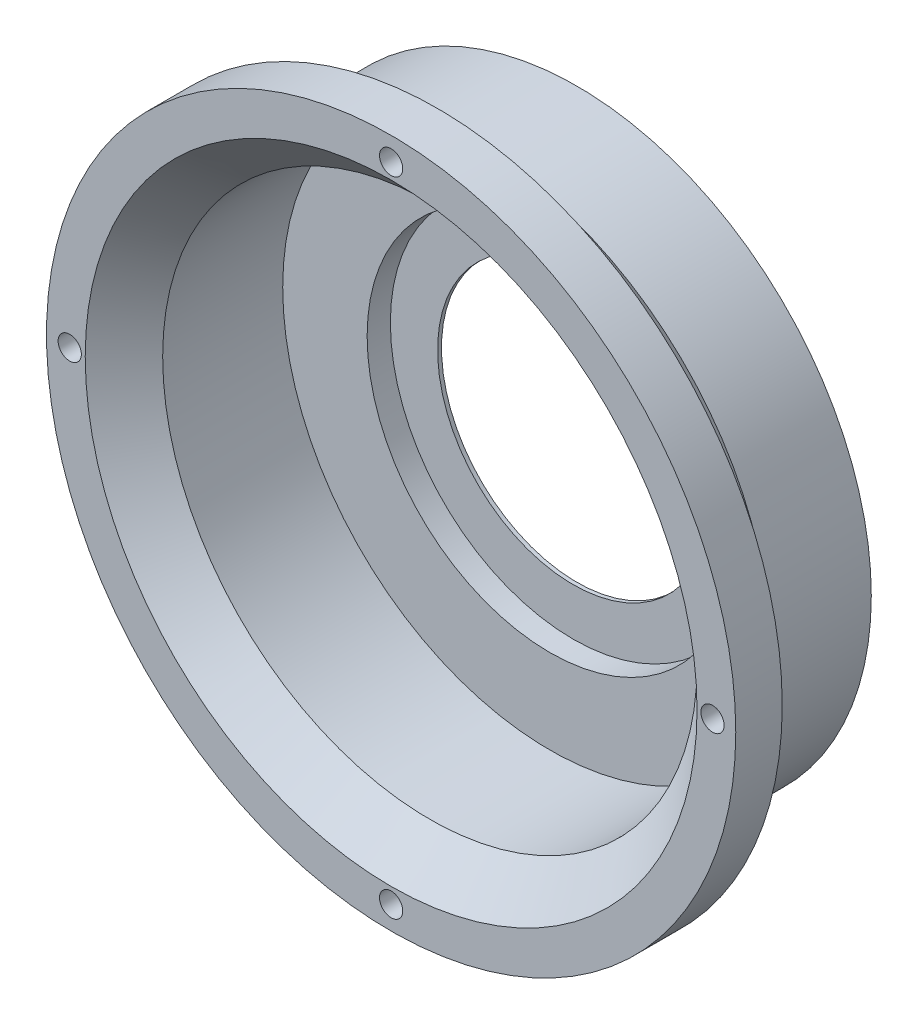
ISO-10303-21;
HEADER;
FILE_DESCRIPTION(('STEP AP214'),'2;1');
FILE_NAME('part.step','',(''),(''),'','','');
FILE_SCHEMA(('AUTOMOTIVE_DESIGN { 1 0 10303 214 1 1 1 1 }'));
ENDSEC;
DATA;
#1=APPLICATION_CONTEXT('core data for automotive mechanical design processes');
#2=APPLICATION_PROTOCOL_DEFINITION('international standard','automotive_design',2000,#1);
#3=PRODUCT_CONTEXT('',#1,'mechanical');
#4=PRODUCT('Part','Part','',(#3));
#5=PRODUCT_RELATED_PRODUCT_CATEGORY('part','',(#4));
#6=PRODUCT_DEFINITION_FORMATION('','',#4);
#7=PRODUCT_DEFINITION_CONTEXT('part definition',#1,'design');
#8=PRODUCT_DEFINITION('design','',#6,#7);
#9=PRODUCT_DEFINITION_SHAPE('','',#8);
#10=(LENGTH_UNIT() NAMED_UNIT(*) SI_UNIT(.MILLI.,.METRE.));
#11=(NAMED_UNIT(*) PLANE_ANGLE_UNIT() SI_UNIT($,.RADIAN.));
#12=(NAMED_UNIT(*) SI_UNIT($,.STERADIAN.) SOLID_ANGLE_UNIT());
#13=UNCERTAINTY_MEASURE_WITH_UNIT(LENGTH_MEASURE(1.E-05),#10,'distance_accuracy_value','');
#14=(GEOMETRIC_REPRESENTATION_CONTEXT(3) GLOBAL_UNCERTAINTY_ASSIGNED_CONTEXT((#13)) GLOBAL_UNIT_ASSIGNED_CONTEXT((#10,
#11,#12)) REPRESENTATION_CONTEXT('',''));
#15=CARTESIAN_POINT('',(0.,0.,0.));
#16=DIRECTION('',(0.,0.,1.));
#17=DIRECTION('',(1.,0.,0.));
#18=AXIS2_PLACEMENT_3D('',#15,#16,#17);
#19=CARTESIAN_POINT('',(0.,0.,24.));
#20=DIRECTION('',(0.,0.,-1.));
#21=DIRECTION('',(-1.,0.,0.));
#22=AXIS2_PLACEMENT_3D('',#19,#20,#21);
#23=CYLINDRICAL_SURFACE('',#22,38.);
#24=CARTESIAN_POINT('',(0.,0.,13.));
#25=DIRECTION('',(0.,0.,1.));
#26=DIRECTION('',(1.,0.,0.));
#27=AXIS2_PLACEMENT_3D('',#24,#25,#26);
#28=CIRCLE('',#27,38.);
#29=CARTESIAN_POINT('',(38.,0.,13.));
#30=VERTEX_POINT('',#29);
#31=EDGE_CURVE('E11',#30,#30,#28,.F.);
#32=ORIENTED_EDGE('',*,*,#31,.T.);
#33=EDGE_LOOP('',(#32));
#34=FACE_BOUND('',#33,.T.);
#35=CARTESIAN_POINT('',(0.,0.,0.));
#36=DIRECTION('',(0.,0.,1.));
#37=DIRECTION('',(1.,0.,0.));
#38=AXIS2_PLACEMENT_3D('',#35,#36,#37);
#39=CIRCLE('',#38,38.);
#40=CARTESIAN_POINT('',(38.,0.,0.));
#41=VERTEX_POINT('',#40);
#42=EDGE_CURVE('E141',#41,#41,#39,.T.);
#43=ORIENTED_EDGE('',*,*,#42,.T.);
#44=EDGE_LOOP('',(#43));
#45=FACE_BOUND('',#44,.T.);
#46=ADVANCED_FACE('F41',(#34,#45),#23,.T.);
#47=CARTESIAN_POINT('',(0.,0.,24.));
#48=DIRECTION('',(0.,0.,1.));
#49=DIRECTION('',(1.,0.,0.));
#50=AXIS2_PLACEMENT_3D('',#47,#48,#49);
#51=PLANE('',#50);
#52=CARTESIAN_POINT('',(0.,0.,24.));
#53=DIRECTION('',(0.,0.,1.));
#54=DIRECTION('',(1.,0.,0.));
#55=AXIS2_PLACEMENT_3D('',#52,#53,#54);
#56=CIRCLE('',#55,39.5);
#57=CARTESIAN_POINT('',(39.5,0.,24.));
#58=VERTEX_POINT('',#57);
#59=EDGE_CURVE('E82',#58,#58,#56,.F.);
#60=ORIENTED_EDGE('',*,*,#59,.T.);
#61=EDGE_LOOP('',(#60));
#62=FACE_BOUND('',#61,.T.);
#63=CARTESIAN_POINT('',(0.,-41.5,24.));
#64=DIRECTION('',(0.,0.,1.));
#65=DIRECTION('',(1.,0.,0.));
#66=AXIS2_PLACEMENT_3D('',#63,#64,#65);
#67=CIRCLE('',#66,1.5);
#68=CARTESIAN_POINT('',(1.5,-41.5,24.));
#69=VERTEX_POINT('',#68);
#70=EDGE_CURVE('E95',#69,#69,#67,.T.);
#71=ORIENTED_EDGE('',*,*,#70,.F.);
#72=EDGE_LOOP('',(#71));
#73=FACE_BOUND('',#72,.T.);
#74=CARTESIAN_POINT('',(-41.5,1.4489647556199E-13,24.));
#75=DIRECTION('',(0.,0.,1.));
#76=DIRECTION('',(1.,0.,0.));
#77=AXIS2_PLACEMENT_3D('',#74,#75,#76);
#78=CIRCLE('',#77,1.5);
#79=CARTESIAN_POINT('',(-40.,1.4489647556199E-13,24.));
#80=VERTEX_POINT('',#79);
#81=EDGE_CURVE('E100',#80,#80,#78,.T.);
#82=ORIENTED_EDGE('',*,*,#81,.F.);
#83=EDGE_LOOP('',(#82));
#84=FACE_BOUND('',#83,.T.);
#85=CARTESIAN_POINT('',(2.8979295112398E-13,41.5,24.));
#86=DIRECTION('',(0.,0.,1.));
#87=DIRECTION('',(1.,0.,0.));
#88=AXIS2_PLACEMENT_3D('',#85,#86,#87);
#89=CIRCLE('',#88,1.5);
#90=CARTESIAN_POINT('',(1.50000000000029,41.5,24.));
#91=VERTEX_POINT('',#90);
#92=EDGE_CURVE('E131',#91,#91,#89,.T.);
#93=ORIENTED_EDGE('',*,*,#92,.F.);
#94=EDGE_LOOP('',(#93));
#95=FACE_BOUND('',#94,.T.);
#96=CARTESIAN_POINT('',(41.5,-4.3468942668597E-13,24.));
#97=DIRECTION('',(0.,0.,1.));
#98=DIRECTION('',(1.,0.,0.));
#99=AXIS2_PLACEMENT_3D('',#96,#97,#98);
#100=CIRCLE('',#99,1.5);
#101=CARTESIAN_POINT('',(43.,-4.3468942668597E-13,24.));
#102=VERTEX_POINT('',#101);
#103=EDGE_CURVE('E132',#102,#102,#100,.T.);
#104=ORIENTED_EDGE('',*,*,#103,.F.);
#105=EDGE_LOOP('',(#104));
#106=FACE_BOUND('',#105,.T.);
#107=CARTESIAN_POINT('',(0.,0.,24.));
#108=DIRECTION('',(0.,0.,1.));
#109=DIRECTION('',(1.,0.,0.));
#110=AXIS2_PLACEMENT_3D('',#107,#108,#109);
#111=CIRCLE('',#110,44.5);
#112=CARTESIAN_POINT('',(44.5,0.,24.));
#113=VERTEX_POINT('',#112);
#114=EDGE_CURVE('E94',#113,#113,#111,.T.);
#115=ORIENTED_EDGE('',*,*,#114,.T.);
#116=EDGE_LOOP('',(#115));
#117=FACE_BOUND('',#116,.T.);
#118=ADVANCED_FACE('F169',(#62,#73,#84,#95,#106,#117),#51,.T.);
#119=CARTESIAN_POINT('',(0.,0.,0.));
#120=DIRECTION('',(0.,0.,1.));
#121=DIRECTION('',(1.,0.,0.));
#122=AXIS2_PLACEMENT_3D('',#119,#120,#121);
#123=PLANE('',#122);
#124=CARTESIAN_POINT('',(0.,0.,0.));
#125=DIRECTION('',(0.,0.,1.));
#126=DIRECTION('',(1.,0.,0.));
#127=AXIS2_PLACEMENT_3D('',#124,#125,#126);
#128=CIRCLE('',#127,17.5);
#129=CARTESIAN_POINT('',(17.5,0.,0.));
#130=VERTEX_POINT('',#129);
#131=EDGE_CURVE('E151',#130,#130,#128,.F.);
#132=ORIENTED_EDGE('',*,*,#131,.F.);
#133=EDGE_LOOP('',(#132));
#134=FACE_BOUND('',#133,.T.);
#135=ORIENTED_EDGE('',*,*,#42,.F.);
#136=EDGE_LOOP('',(#135));
#137=FACE_BOUND('',#136,.T.);
#138=ADVANCED_FACE('F172',(#134,#137),#123,.F.);
#139=CARTESIAN_POINT('',(0.,0.,24.));
#140=DIRECTION('',(0.,0.,-1.));
#141=DIRECTION('',(-1.,0.,0.));
#142=AXIS2_PLACEMENT_3D('',#139,#140,#141);
#143=CYLINDRICAL_SURFACE('',#142,34.5);
#144=CARTESIAN_POINT('',(0.,0.,19.));
#145=DIRECTION('',(0.,0.,1.));
#146=DIRECTION('',(1.,0.,0.));
#147=AXIS2_PLACEMENT_3D('',#144,#145,#146);
#148=CIRCLE('',#147,34.5);
#149=CARTESIAN_POINT('',(34.5,0.,19.));
#150=VERTEX_POINT('',#149);
#151=EDGE_CURVE('E138',#150,#150,#148,.T.);
#152=ORIENTED_EDGE('',*,*,#151,.T.);
#153=EDGE_LOOP('',(#152));
#154=FACE_BOUND('',#153,.T.);
#155=CARTESIAN_POINT('',(0.,0.,3.5));
#156=DIRECTION('',(0.,0.,1.));
#157=DIRECTION('',(1.,0.,0.));
#158=AXIS2_PLACEMENT_3D('',#155,#156,#157);
#159=CIRCLE('',#158,34.5);
#160=CARTESIAN_POINT('',(34.5,0.,3.5));
#161=VERTEX_POINT('',#160);
#162=EDGE_CURVE('E144',#161,#161,#159,.T.);
#163=ORIENTED_EDGE('',*,*,#162,.F.);
#164=EDGE_LOOP('',(#163));
#165=FACE_BOUND('',#164,.T.);
#166=ADVANCED_FACE('F214',(#154,#165),#143,.F.);
#167=CARTESIAN_POINT('',(0.,0.,3.5));
#168=DIRECTION('',(0.,0.,1.));
#169=DIRECTION('',(1.,0.,0.));
#170=AXIS2_PLACEMENT_3D('',#167,#168,#169);
#171=PLANE('',#170);
#172=CARTESIAN_POINT('',(0.,0.,3.5));
#173=DIRECTION('',(0.,0.,1.));
#174=DIRECTION('',(1.,0.,0.));
#175=AXIS2_PLACEMENT_3D('',#172,#173,#174);
#176=CIRCLE('',#175,23.6);
#177=CARTESIAN_POINT('',(23.6,0.,3.5));
#178=VERTEX_POINT('',#177);
#179=EDGE_CURVE('E148',#178,#178,#176,.T.);
#180=ORIENTED_EDGE('',*,*,#179,.F.);
#181=EDGE_LOOP('',(#180));
#182=FACE_BOUND('',#181,.T.);
#183=ORIENTED_EDGE('',*,*,#162,.T.);
#184=EDGE_LOOP('',(#183));
#185=FACE_BOUND('',#184,.T.);
#186=ADVANCED_FACE('F216',(#182,#185),#171,.T.);
#187=CARTESIAN_POINT('',(0.,0.,0.5));
#188=DIRECTION('',(0.,0.,1.));
#189=DIRECTION('',(1.,0.,0.));
#190=AXIS2_PLACEMENT_3D('',#187,#188,#189);
#191=CYLINDRICAL_SURFACE('',#190,23.6);
#192=CARTESIAN_POINT('',(0.,0.,0.5));
#193=DIRECTION('',(0.,0.,1.));
#194=DIRECTION('',(1.,0.,0.));
#195=AXIS2_PLACEMENT_3D('',#192,#193,#194);
#196=CIRCLE('',#195,23.6);
#197=CARTESIAN_POINT('',(23.6,0.,0.5));
#198=VERTEX_POINT('',#197);
#199=EDGE_CURVE('E147',#198,#198,#196,.T.);
#200=ORIENTED_EDGE('',*,*,#199,.F.);
#201=EDGE_LOOP('',(#200));
#202=FACE_BOUND('',#201,.T.);
#203=ORIENTED_EDGE('',*,*,#179,.T.);
#204=EDGE_LOOP('',(#203));
#205=FACE_BOUND('',#204,.T.);
#206=ADVANCED_FACE('F221',(#202,#205),#191,.F.);
#207=CARTESIAN_POINT('',(0.,0.,0.5));
#208=DIRECTION('',(0.,0.,1.));
#209=DIRECTION('',(1.,0.,0.));
#210=AXIS2_PLACEMENT_3D('',#207,#208,#209);
#211=PLANE('',#210);
#212=CARTESIAN_POINT('',(0.,0.,0.5));
#213=DIRECTION('',(0.,0.,1.));
#214=DIRECTION('',(1.,0.,0.));
#215=AXIS2_PLACEMENT_3D('',#212,#213,#214);
#216=CIRCLE('',#215,17.5);
#217=CARTESIAN_POINT('',(17.5,0.,0.5));
#218=VERTEX_POINT('',#217);
#219=EDGE_CURVE('E156',#218,#218,#216,.T.);
#220=ORIENTED_EDGE('',*,*,#219,.F.);
#221=EDGE_LOOP('',(#220));
#222=FACE_BOUND('',#221,.T.);
#223=ORIENTED_EDGE('',*,*,#199,.T.);
#224=EDGE_LOOP('',(#223));
#225=FACE_BOUND('',#224,.T.);
#226=ADVANCED_FACE('F190',(#222,#225),#211,.T.);
#227=CARTESIAN_POINT('',(0.,0.,-49.4974746830583));
#228=DIRECTION('',(0.,0.,1.));
#229=DIRECTION('',(1.,0.,0.));
#230=AXIS2_PLACEMENT_3D('',#227,#228,#229);
#231=CYLINDRICAL_SURFACE('',#230,17.5);
#232=ORIENTED_EDGE('',*,*,#131,.T.);
#233=EDGE_LOOP('',(#232));
#234=FACE_BOUND('',#233,.T.);
#235=ORIENTED_EDGE('',*,*,#219,.T.);
#236=EDGE_LOOP('',(#235));
#237=FACE_BOUND('',#236,.T.);
#238=ADVANCED_FACE('F183',(#234,#237),#231,.F.);
#239=CARTESIAN_POINT('',(0.,0.,18.));
#240=DIRECTION('',(0.,0.,1.));
#241=DIRECTION('',(1.,0.,0.));
#242=AXIS2_PLACEMENT_3D('',#239,#240,#241);
#243=CYLINDRICAL_SURFACE('',#242,44.5);
#244=CARTESIAN_POINT('',(0.,0.,18.));
#245=DIRECTION('',(0.,0.,1.));
#246=DIRECTION('',(1.,0.,0.));
#247=AXIS2_PLACEMENT_3D('',#244,#245,#246);
#248=CIRCLE('',#247,44.5);
#249=CARTESIAN_POINT('',(44.5,0.,18.));
#250=VERTEX_POINT('',#249);
#251=EDGE_CURVE('E97',#250,#250,#248,.T.);
#252=ORIENTED_EDGE('',*,*,#251,.T.);
#253=EDGE_LOOP('',(#252));
#254=FACE_BOUND('',#253,.T.);
#255=ORIENTED_EDGE('',*,*,#114,.F.);
#256=EDGE_LOOP('',(#255));
#257=FACE_BOUND('',#256,.T.);
#258=ADVANCED_FACE('F181',(#254,#257),#243,.T.);
#259=CARTESIAN_POINT('',(0.,0.,18.));
#260=DIRECTION('',(0.,0.,1.));
#261=DIRECTION('',(1.,0.,0.));
#262=AXIS2_PLACEMENT_3D('',#259,#260,#261);
#263=PLANE('',#262);
#264=CARTESIAN_POINT('',(0.,0.,18.));
#265=DIRECTION('',(0.,0.,1.));
#266=DIRECTION('',(1.,0.,0.));
#267=AXIS2_PLACEMENT_3D('',#264,#265,#266);
#268=CIRCLE('',#267,43.);
#269=CARTESIAN_POINT('',(0.,-43.,18.));
#270=VERTEX_POINT('',#269);
#271=CARTESIAN_POINT('',(43.,-4.50401088637133E-13,18.));
#272=VERTEX_POINT('',#271);
#273=EDGE_CURVE('E74',#270,#272,#268,.T.);
#274=ORIENTED_EDGE('',*,*,#273,.T.);
#275=CARTESIAN_POINT('',(0.,0.,18.));
#276=DIRECTION('',(0.,0.,1.));
#277=DIRECTION('',(1.,0.,0.));
#278=AXIS2_PLACEMENT_3D('',#275,#276,#277);
#279=CIRCLE('',#278,43.);
#280=CARTESIAN_POINT('',(3.00267391066803E-13,43.,18.));
#281=VERTEX_POINT('',#280);
#282=EDGE_CURVE('E57',#272,#281,#279,.T.);
#283=ORIENTED_EDGE('',*,*,#282,.T.);
#284=CARTESIAN_POINT('',(0.,0.,18.));
#285=DIRECTION('',(0.,0.,1.));
#286=DIRECTION('',(1.,0.,0.));
#287=AXIS2_PLACEMENT_3D('',#284,#285,#286);
#288=CIRCLE('',#287,43.);
#289=CARTESIAN_POINT('',(-43.,1.50133693496514E-13,18.));
#290=VERTEX_POINT('',#289);
#291=EDGE_CURVE('E87',#281,#290,#288,.T.);
#292=ORIENTED_EDGE('',*,*,#291,.T.);
#293=CARTESIAN_POINT('',(0.,0.,18.));
#294=DIRECTION('',(0.,0.,1.));
#295=DIRECTION('',(1.,0.,0.));
#296=AXIS2_PLACEMENT_3D('',#293,#294,#295);
#297=CIRCLE('',#296,43.);
#298=EDGE_CURVE('E81',#290,#270,#297,.T.);
#299=ORIENTED_EDGE('',*,*,#298,.T.);
#300=EDGE_LOOP('',(#274,#283,#292,#299));
#301=FACE_BOUND('',#300,.T.);
#302=ORIENTED_EDGE('',*,*,#251,.F.);
#303=EDGE_LOOP('',(#302));
#304=FACE_BOUND('',#303,.T.);
#305=ADVANCED_FACE('F85',(#301,#304),#263,.F.);
#306=CARTESIAN_POINT('',(41.5,-4.3468942668597E-13,13.7573593128807));
#307=DIRECTION('',(0.,0.,1.));
#308=DIRECTION('',(1.,0.,0.));
#309=AXIS2_PLACEMENT_3D('',#306,#307,#308);
#310=CYLINDRICAL_SURFACE('',#309,1.5);
#311=CARTESIAN_POINT('',(40.,-4.19404963032972E-13,15.));
#312=CARTESIAN_POINT('',(40.0000054472923,0.0661882973322198,15.000005743782));
#313=CARTESIAN_POINT('',(40.0044261040572,0.132486348752539,15.0045928921817));
#314=CARTESIAN_POINT('',(40.0217322131698,0.262818295696041,15.0225417598906));
#315=CARTESIAN_POINT('',(40.0346391255251,0.326846016247925,15.0359257245213));
#316=CARTESIAN_POINT('',(40.0677527325686,0.45024295856951,15.0702353901676));
#317=CARTESIAN_POINT('',(40.0879024431701,0.509644259724409,15.0911022154164));
#318=CARTESIAN_POINT('',(40.1342423615317,0.623281385013478,15.1390419797506));
#319=CARTESIAN_POINT('',(40.1604331510053,0.677516710989422,15.1661155164971));
#320=CARTESIAN_POINT('',(40.2300101729092,0.802638076158851,15.2379499559189));
#321=CARTESIAN_POINT('',(40.275941090042,0.870618363966243,15.28530351592));
#322=CARTESIAN_POINT('',(40.3748693088483,0.995208082789842,15.3870865955773));
#323=CARTESIAN_POINT('',(40.427883290934,1.05178985669921,15.4415328104258));
#324=CARTESIAN_POINT('',(40.5611571305409,1.17463330077802,15.5781018968541));
#325=CARTESIAN_POINT('',(40.6438170098305,1.2356761631156,15.6625671880098));
#326=CARTESIAN_POINT('',(40.8150584339953,1.33821876872422,15.8369624041623));
#327=CARTESIAN_POINT('',(40.9036449064991,1.37970201276868,15.9268968706721));
#328=CARTESIAN_POINT('',(41.0869694982902,1.44539057866594,16.1123742011504));
#329=CARTESIAN_POINT('',(41.1818118197911,1.46905384802057,16.2080041866863));
#330=CARTESIAN_POINT('',(41.3732531986949,1.4977681664745,16.4003537018665));
#331=CARTESIAN_POINT('',(41.4698534498262,1.50280605498494,16.497073953502));
#332=CARTESIAN_POINT('',(41.6837044004202,1.49333374649012,16.7104438487362));
#333=CARTESIAN_POINT('',(41.800951156682,1.47441034750825,16.826929776122));
#334=CARTESIAN_POINT('',(42.0317626850694,1.40770479651774,17.0553120732162));
#335=CARTESIAN_POINT('',(42.1453319431435,1.35995931655902,17.1672140824328));
#336=CARTESIAN_POINT('',(42.3247526676781,1.2555464944452,17.3433499832528));
#337=CARTESIAN_POINT('',(42.3932235806938,1.20807368378323,17.4103960709151));
#338=CARTESIAN_POINT('',(42.5243490950635,1.09907067403301,17.5385124815464));
#339=CARTESIAN_POINT('',(42.5870133507756,1.03756441933061,17.5995927330171));
#340=CARTESIAN_POINT('',(42.6899326923088,0.915883787996921,17.6997226744458));
#341=CARTESIAN_POINT('',(42.7320043539671,0.858749354726768,17.7405868654106));
#342=CARTESIAN_POINT('',(42.809126674934,0.735820536182839,17.8154050393435));
#343=CARTESIAN_POINT('',(42.844186083608,0.670037114574688,17.8493676344655));
#344=CARTESIAN_POINT('',(42.8994441349478,0.543507673920048,17.9028489175321));
#345=CARTESIAN_POINT('',(42.9211922231482,0.484082319954972,17.9238774699195));
#346=CARTESIAN_POINT('',(42.9573157365138,0.361016454348,17.9587885419139));
#347=CARTESIAN_POINT('',(42.9716959629677,0.297378718330247,17.9726757152431));
#348=CARTESIAN_POINT('',(42.9921163882609,0.167181747749942,17.9923919014507));
#349=CARTESIAN_POINT('',(42.9981127672809,0.100609025438486,17.9981785756755));
#350=CARTESIAN_POINT('',(43.0011236727402,-0.0329275793021889,18.0010844969985));
#351=CARTESIAN_POINT('',(42.9981398824998,-0.0998913860746713,17.9982053684896));
#352=CARTESIAN_POINT('',(42.9840797439481,-0.226293201366086,17.984632797652));
#353=CARTESIAN_POINT('',(42.9737112993543,-0.285887769800416,17.9746229044776));
#354=CARTESIAN_POINT('',(42.9463512494883,-0.402032801008781,17.9481935246122));
#355=CARTESIAN_POINT('',(42.9293585876895,-0.458582776548525,17.9317730154622));
#356=CARTESIAN_POINT('',(42.8884072129076,-0.57108208153932,17.8921695879123));
#357=CARTESIAN_POINT('',(42.8640746779084,-0.626765252109117,17.8686234715992));
#358=CARTESIAN_POINT('',(42.8101319289882,-0.732874049928063,17.8163711117418));
#359=CARTESIAN_POINT('',(42.7805186369436,-0.783296583463531,17.7876618585506));
#360=CARTESIAN_POINT('',(42.699846530062,-0.904528284009289,17.7093608020299));
#361=CARTESIAN_POINT('',(42.6458709543426,-0.971550922944913,17.6568915057028));
#362=CARTESIAN_POINT('',(42.5310238550869,-1.09269933390905,17.5450130415171));
#363=CARTESIAN_POINT('',(42.4701351755109,-1.14679193835882,17.4855865964237));
#364=CARTESIAN_POINT('',(42.3206036957628,-1.26030154585405,17.3393103686237));
#365=CARTESIAN_POINT('',(42.2299643635443,-1.31441091934273,17.2503890224019));
#366=CARTESIAN_POINT('',(42.0440946896208,-1.40161071999443,17.0674252444808));
#367=CARTESIAN_POINT('',(41.9488617232188,-1.43468897367029,16.9733798809636));
#368=CARTESIAN_POINT('',(41.754050500248,-1.48180205072087,16.7803271082568));
#369=CARTESIAN_POINT('',(41.65442284345,-1.49535796703668,16.6812547208232));
#370=CARTESIAN_POINT('',(41.4550398134853,-1.50264435724385,16.4822637291344));
#371=CARTESIAN_POINT('',(41.3552844201638,-1.49635305378194,16.382344315407));
#372=CARTESIAN_POINT('',(41.1980818438425,-1.47049474056435,16.2243164823801));
#373=CARTESIAN_POINT('',(41.1399566719465,-1.4573811586411,16.1657598874421));
#374=CARTESIAN_POINT('',(41.024818494981,-1.42400730509327,16.0495226195485));
#375=CARTESIAN_POINT('',(40.9678058671454,-1.403744652365,15.9918422451157));
#376=CARTESIAN_POINT('',(40.855537568326,-1.35587114291762,15.8780240690296));
#377=CARTESIAN_POINT('',(40.8002791179353,-1.32827263452789,15.8218838484465));
#378=CARTESIAN_POINT('',(40.6921017761149,-1.26538976339165,15.7117609150044));
#379=CARTESIAN_POINT('',(40.6391811345518,-1.23011127149174,15.6577765912044));
#380=CARTESIAN_POINT('',(40.528045275473,-1.14497910210727,15.544191706991));
#381=CARTESIAN_POINT('',(40.47037870989,-1.09368554960414,15.4851156408008));
#382=CARTESIAN_POINT('',(40.3611361345072,-0.979397221938192,15.3729789706544));
#383=CARTESIAN_POINT('',(40.3095500136442,-0.916422333549175,15.3199083863349));
#384=CARTESIAN_POINT('',(40.2254419945224,-0.793570757236304,15.2332342199484));
#385=CARTESIAN_POINT('',(40.1912249896784,-0.736075608699613,15.1979189223471));
#386=CARTESIAN_POINT('',(40.1296678751256,-0.613881793946159,15.1343175431936));
#387=CARTESIAN_POINT('',(40.1023216895931,-0.549189565634589,15.1060252515083));
#388=CARTESIAN_POINT('',(40.0604970360535,-0.425779221323343,15.0627213087988));
#389=CARTESIAN_POINT('',(40.0445917695185,-0.368062737396531,15.0462392680033));
#390=CARTESIAN_POINT('',(40.0196980976932,-0.249680028063641,15.0204336860041));
#391=CARTESIAN_POINT('',(40.0106918154219,-0.189021862463329,15.0110916434356));
#392=CARTESIAN_POINT('',(40.0036387594053,-0.106579571044911,15.003775060487));
#393=CARTESIAN_POINT('',(40.0022765949019,-0.0853161328877249,15.002361911423));
#394=CARTESIAN_POINT('',(40.0004562445343,-0.0427056168208035,15.0004733592491));
#395=CARTESIAN_POINT('',(39.9999982421951,-0.0213585228116477,14.9999981465198));
#396=CARTESIAN_POINT('',(40.,-4.19404963032972E-13,15.));
#397=B_SPLINE_CURVE_WITH_KNOTS('',3,(#311,#312,#313,#314,#315,#316,#317,#318,#319,#320,#321,
#322,#323,#324,#325,#326,#327,#328,#329,#330,#331,#332,#333,#334,#335,#336,#337,#338,#339,#340,
#341,#342,#343,#344,#345,#346,#347,#348,#349,#350,#351,#352,#353,#354,#355,#356,#357,#358,#359,
#360,#361,#362,#363,#364,#365,#366,#367,#368,#369,#370,#371,#372,#373,#374,#375,#376,#377,#378,
#379,#380,#381,#382,#383,#384,#385,#386,#387,#388,#389,#390,#391,#392,#393,#394,#395,#396),
.UNSPECIFIED.,.T.,.F.,(4,2,2,2,2,2,2,2,2,2,2,2,2,2,2,2,2,2,2,2,2,2,2,2,2,2,2,2,2,2,2,2,2,2,2,2,
2,2,2,2,2,2,4),(0.,0.198464940872941,0.397433699351377,0.594870119465364,0.792325559263223,
1.07493281835343,1.35821774254563,1.75511611139778,2.15234868166953,2.56122412517795,
2.97038842260693,3.46709873280756,3.96317837707443,4.28303223456898,4.60234437345552,
4.84712653965447,5.09160135303725,5.29083380221154,5.48993625532039,5.69007551479113,
5.89017726076803,6.0733057654406,6.25646349007053,6.45125159408388,6.64615361234699,
6.94682750071999,7.24826458137449,7.66011845338932,8.07221050312903,8.49424891048967,
8.91675056031071,9.16710879406121,9.41755049216071,9.66757326646308,9.91740558162512,
10.2080777262443,10.4982594866056,10.7244228042368,10.9503854175004,11.1359244717603,
11.3209811065245,11.3850114259759,11.4490547408471),.UNSPECIFIED.);
#398=EDGE_CURVE('E47',#272,#272,#397,.T.);
#399=ORIENTED_EDGE('',*,*,#398,.T.);
#400=EDGE_LOOP('',(#399));
#401=FACE_BOUND('',#400,.T.);
#402=ORIENTED_EDGE('',*,*,#103,.T.);
#403=EDGE_LOOP('',(#402));
#404=FACE_BOUND('',#403,.T.);
#405=ADVANCED_FACE('F124',(#401,#404),#310,.F.);
#406=CARTESIAN_POINT('',(2.8979295112398E-13,41.5,13.7573593128807));
#407=DIRECTION('',(0.,0.,1.));
#408=DIRECTION('',(1.,0.,0.));
#409=AXIS2_PLACEMENT_3D('',#406,#407,#408);
#410=CYLINDRICAL_SURFACE('',#409,1.5);
#411=CARTESIAN_POINT('',(2.79745709479246E-13,40.,15.));
#412=CARTESIAN_POINT('',(-0.0661882973323588,40.0000054472923,15.000005743782));
#413=CARTESIAN_POINT('',(-0.132486348752677,40.0044261040572,15.0045928921817));
#414=CARTESIAN_POINT('',(-0.262818295696179,40.0217322131698,15.0225417598906));
#415=CARTESIAN_POINT('',(-0.326846016248065,40.0346391255251,15.0359257245213));
#416=CARTESIAN_POINT('',(-0.45024295856965,40.0677527325686,15.0702353901676));
#417=CARTESIAN_POINT('',(-0.509644259724547,40.0879024431701,15.0911022154164));
#418=CARTESIAN_POINT('',(-0.623281385013615,40.1342423615317,15.1390419797506));
#419=CARTESIAN_POINT('',(-0.677516710989561,40.1604331510053,15.1661155164971));
#420=CARTESIAN_POINT('',(-0.802638076158994,40.2300101729092,15.2379499559189));
#421=CARTESIAN_POINT('',(-0.870618363966387,40.275941090042,15.28530351592));
#422=CARTESIAN_POINT('',(-0.995208082789986,40.3748693088483,15.3870865955773));
#423=CARTESIAN_POINT('',(-1.05178985669935,40.427883290934,15.4415328104258));
#424=CARTESIAN_POINT('',(-1.17463330077817,40.5611571305408,15.5781018968541));
#425=CARTESIAN_POINT('',(-1.23567616311575,40.6438170098305,15.6625671880098));
#426=CARTESIAN_POINT('',(-1.33821876872437,40.8150584339952,15.8369624041623));
#427=CARTESIAN_POINT('',(-1.37970201276883,40.9036449064991,15.9268968706721));
#428=CARTESIAN_POINT('',(-1.44539057866609,41.0869694982902,16.1123742011504));
#429=CARTESIAN_POINT('',(-1.46905384802072,41.1818118197911,16.2080041866863));
#430=CARTESIAN_POINT('',(-1.49776816647464,41.3732531986949,16.4003537018665));
#431=CARTESIAN_POINT('',(-1.50280605498509,41.4698534498262,16.497073953502));
#432=CARTESIAN_POINT('',(-1.49333374649027,41.6837044004202,16.7104438487362));
#433=CARTESIAN_POINT('',(-1.47441034750839,41.800951156682,16.826929776122));
#434=CARTESIAN_POINT('',(-1.40770479651788,42.0317626850694,17.0553120732162));
#435=CARTESIAN_POINT('',(-1.35995931655916,42.1453319431435,17.1672140824328));
#436=CARTESIAN_POINT('',(-1.25554649444534,42.3247526676781,17.3433499832528));
#437=CARTESIAN_POINT('',(-1.20807368378338,42.3932235806938,17.4103960709151));
#438=CARTESIAN_POINT('',(-1.09907067403316,42.5243490950635,17.5385124815464));
#439=CARTESIAN_POINT('',(-1.03756441933075,42.5870133507756,17.5995927330171));
#440=CARTESIAN_POINT('',(-0.91588378799706,42.6899326923088,17.6997226744458));
#441=CARTESIAN_POINT('',(-0.858749354726906,42.7320043539671,17.7405868654106));
#442=CARTESIAN_POINT('',(-0.735820536182975,42.809126674934,17.8154050393435));
#443=CARTESIAN_POINT('',(-0.670037114574825,42.844186083608,17.8493676344655));
#444=CARTESIAN_POINT('',(-0.543507673920184,42.8994441349478,17.9028489175321));
#445=CARTESIAN_POINT('',(-0.484082319955106,42.9211922231482,17.9238774699195));
#446=CARTESIAN_POINT('',(-0.361016454348132,42.9573157365138,17.9587885419139));
#447=CARTESIAN_POINT('',(-0.297378718330378,42.9716959629677,17.9726757152431));
#448=CARTESIAN_POINT('',(-0.167181747750072,42.9921163882608,17.9923919014507));
#449=CARTESIAN_POINT('',(-0.100609025438615,42.9981127672809,17.9981785756755));
#450=CARTESIAN_POINT('',(0.032927579302059,43.0011236727402,18.0010844969985));
#451=CARTESIAN_POINT('',(0.0998913860745412,42.9981398824998,17.9982053684896));
#452=CARTESIAN_POINT('',(0.226293201365955,42.9840797439481,17.984632797652));
#453=CARTESIAN_POINT('',(0.285887769800286,42.9737112993543,17.9746229044776));
#454=CARTESIAN_POINT('',(0.402032801008649,42.9463512494883,17.9481935246122));
#455=CARTESIAN_POINT('',(0.45858277654839,42.9293585876895,17.9317730154622));
#456=CARTESIAN_POINT('',(0.571082081539185,42.8884072129076,17.8921695879123));
#457=CARTESIAN_POINT('',(0.626765252108984,42.8640746779084,17.8686234715991));
#458=CARTESIAN_POINT('',(0.732874049927932,42.8101319289881,17.8163711117418));
#459=CARTESIAN_POINT('',(0.7832965834634,42.7805186369435,17.7876618585506));
#460=CARTESIAN_POINT('',(0.90452828400916,42.699846530062,17.7093608020299));
#461=CARTESIAN_POINT('',(0.971550922944784,42.6458709543425,17.6568915057028));
#462=CARTESIAN_POINT('',(1.09269933390892,42.5310238550869,17.5450130415171));
#463=CARTESIAN_POINT('',(1.14679193835869,42.4701351755109,17.4855865964237));
#464=CARTESIAN_POINT('',(1.26030154585392,42.3206036957627,17.3393103686237));
#465=CARTESIAN_POINT('',(1.3144109193426,42.2299643635443,17.2503890224019));
#466=CARTESIAN_POINT('',(1.4016107199943,42.0440946896208,17.0674252444807));
#467=CARTESIAN_POINT('',(1.43468897367015,41.9488617232188,16.9733798809636));
#468=CARTESIAN_POINT('',(1.48180205072073,41.7540505002479,16.7803271082567));
#469=CARTESIAN_POINT('',(1.49535796703654,41.65442284345,16.6812547208232));
#470=CARTESIAN_POINT('',(1.50264435724371,41.4550398134852,16.4822637291343));
#471=CARTESIAN_POINT('',(1.49635305378179,41.3552844201638,16.382344315407));
#472=CARTESIAN_POINT('',(1.4704947405642,41.1980818438424,16.2243164823801));
#473=CARTESIAN_POINT('',(1.45738115864095,41.1399566719465,16.165759887442));
#474=CARTESIAN_POINT('',(1.42400730509312,41.0248184949809,16.0495226195485));
#475=CARTESIAN_POINT('',(1.40374465236485,40.9678058671453,15.9918422451156));
#476=CARTESIAN_POINT('',(1.35587114291746,40.855537568326,15.8780240690295));
#477=CARTESIAN_POINT('',(1.32827263452774,40.8002791179353,15.8218838484465));
#478=CARTESIAN_POINT('',(1.26538976339149,40.6921017761149,15.7117609150044));
#479=CARTESIAN_POINT('',(1.23011127149158,40.6391811345518,15.6577765912043));
#480=CARTESIAN_POINT('',(1.14497910210711,40.528045275473,15.5441917069909));
#481=CARTESIAN_POINT('',(1.09368554960398,40.47037870989,15.4851156408008));
#482=CARTESIAN_POINT('',(0.979397221938034,40.3611361345071,15.3729789706544));
#483=CARTESIAN_POINT('',(0.91642233354902,40.3095500136441,15.3199083863349));
#484=CARTESIAN_POINT('',(0.793570757236146,40.2254419945224,15.2332342199484));
#485=CARTESIAN_POINT('',(0.73607560869945,40.1912249896784,15.1979189223471));
#486=CARTESIAN_POINT('',(0.613881793945994,40.1296678751256,15.1343175431936));
#487=CARTESIAN_POINT('',(0.549189565634426,40.1023216895931,15.1060252515083));
#488=CARTESIAN_POINT('',(0.425779221323182,40.0604970360535,15.0627213087987));
#489=CARTESIAN_POINT('',(0.36806273739637,40.0445917695184,15.0462392680033));
#490=CARTESIAN_POINT('',(0.249680028063477,40.0196980976932,15.0204336860041));
#491=CARTESIAN_POINT('',(0.189021862463165,40.0106918154219,15.0110916434356));
#492=CARTESIAN_POINT('',(0.106579571044751,40.0036387594053,15.003775060487));
#493=CARTESIAN_POINT('',(0.0853161328875697,40.0022765949019,15.002361911423));
#494=CARTESIAN_POINT('',(0.0427056168206567,40.0004562445342,15.0004733592491));
#495=CARTESIAN_POINT('',(0.0213585228115044,39.9999982421951,14.9999981465198));
#496=CARTESIAN_POINT('',(2.79745709479246E-13,40.,15.));
#497=B_SPLINE_CURVE_WITH_KNOTS('',3,(#411,#412,#413,#414,#415,#416,#417,#418,#419,#420,#421,
#422,#423,#424,#425,#426,#427,#428,#429,#430,#431,#432,#433,#434,#435,#436,#437,#438,#439,#440,
#441,#442,#443,#444,#445,#446,#447,#448,#449,#450,#451,#452,#453,#454,#455,#456,#457,#458,#459,
#460,#461,#462,#463,#464,#465,#466,#467,#468,#469,#470,#471,#472,#473,#474,#475,#476,#477,#478,
#479,#480,#481,#482,#483,#484,#485,#486,#487,#488,#489,#490,#491,#492,#493,#494,#495,#496),
.UNSPECIFIED.,.T.,.F.,(4,2,2,2,2,2,2,2,2,2,2,2,2,2,2,2,2,2,2,2,2,2,2,2,2,2,2,2,2,2,2,2,2,2,2,2,
2,2,2,2,2,2,4),(0.,0.198464940872939,0.397433699351374,0.594870119465364,0.792325559263223,
1.07493281835344,1.35821774254564,1.75511611139779,2.15234868166954,2.56122412517796,
2.97038842260694,3.46709873280757,3.96317837707443,4.28303223456898,4.60234437345553,
4.84712653965448,5.09160135303726,5.29083380221156,5.48993625532041,5.69007551479116,
5.89017726076805,6.07330576544062,6.25646349007056,6.45125159408391,6.64615361234701,
6.94682750072003,7.24826458137453,7.66011845338937,8.07221050312908,8.49424891048972,
8.91675056031076,9.16710879406126,9.41755049216076,9.66757326646312,9.91740558162516,
10.2080777262443,10.4982594866056,10.7244228042368,10.9503854175004,11.1359244717603,
11.3209811065245,11.3850114259759,11.4490547408471),.UNSPECIFIED.);
#498=EDGE_CURVE('E65',#281,#281,#497,.T.);
#499=ORIENTED_EDGE('',*,*,#498,.T.);
#500=EDGE_LOOP('',(#499));
#501=FACE_BOUND('',#500,.T.);
#502=ORIENTED_EDGE('',*,*,#92,.T.);
#503=EDGE_LOOP('',(#502));
#504=FACE_BOUND('',#503,.T.);
#505=ADVANCED_FACE('F120',(#501,#504),#410,.F.);
#506=CARTESIAN_POINT('',(-41.5,1.4489647556199E-13,13.7573593128807));
#507=DIRECTION('',(0.,0.,1.));
#508=DIRECTION('',(1.,0.,0.));
#509=AXIS2_PLACEMENT_3D('',#506,#507,#508);
#510=CYLINDRICAL_SURFACE('',#509,1.5);
#511=CARTESIAN_POINT('',(-40.,1.39744694028084E-13,15.));
#512=CARTESIAN_POINT('',(-40.0000054472923,-0.0661882973324991,15.000005743782));
#513=CARTESIAN_POINT('',(-40.0044261040572,-0.132486348752817,15.0045928921817));
#514=CARTESIAN_POINT('',(-40.0217322131698,-0.262818295696319,15.0225417598906));
#515=CARTESIAN_POINT('',(-40.0346391255251,-0.326846016248204,15.0359257245213));
#516=CARTESIAN_POINT('',(-40.0677527325686,-0.45024295856979,15.0702353901676));
#517=CARTESIAN_POINT('',(-40.0879024431701,-0.509644259724689,15.0911022154164));
#518=CARTESIAN_POINT('',(-40.1342423615317,-0.623281385013757,15.1390419797506));
#519=CARTESIAN_POINT('',(-40.1604331510053,-0.677516710989702,15.1661155164971));
#520=CARTESIAN_POINT('',(-40.2300101729092,-0.802638076159131,15.2379499559189));
#521=CARTESIAN_POINT('',(-40.275941090042,-0.870618363966525,15.28530351592));
#522=CARTESIAN_POINT('',(-40.3748693088483,-0.995208082790125,15.3870865955773));
#523=CARTESIAN_POINT('',(-40.427883290934,-1.05178985669949,15.4415328104258));
#524=CARTESIAN_POINT('',(-40.5611571305408,-1.1746333007783,15.5781018968541));
#525=CARTESIAN_POINT('',(-40.6438170098305,-1.23567616311588,15.6625671880098));
#526=CARTESIAN_POINT('',(-40.8150584339952,-1.3382187687245,15.8369624041623));
#527=CARTESIAN_POINT('',(-40.9036449064991,-1.37970201276896,15.9268968706721));
#528=CARTESIAN_POINT('',(-41.0869694982902,-1.44539057866623,16.1123742011504));
#529=CARTESIAN_POINT('',(-41.1818118197911,-1.46905384802086,16.2080041866863));
#530=CARTESIAN_POINT('',(-41.3732531986949,-1.49776816647478,16.4003537018665));
#531=CARTESIAN_POINT('',(-41.4698534498262,-1.50280605498523,16.497073953502));
#532=CARTESIAN_POINT('',(-41.6837044004201,-1.49333374649042,16.7104438487361));
#533=CARTESIAN_POINT('',(-41.800951156682,-1.47441034750854,16.8269297761219));
#534=CARTESIAN_POINT('',(-42.0317626850694,-1.40770479651803,17.0553120732162));
#535=CARTESIAN_POINT('',(-42.1453319431434,-1.35995931655932,17.1672140824328));
#536=CARTESIAN_POINT('',(-42.3247526676781,-1.25554649444549,17.3433499832528));
#537=CARTESIAN_POINT('',(-42.3932235806938,-1.20807368378352,17.4103960709151));
#538=CARTESIAN_POINT('',(-42.5243490950635,-1.09907067403331,17.5385124815464));
#539=CARTESIAN_POINT('',(-42.5870133507756,-1.0375644193309,17.5995927330171));
#540=CARTESIAN_POINT('',(-42.6899326923088,-0.915883787997216,17.6997226744458));
#541=CARTESIAN_POINT('',(-42.7320043539671,-0.858749354727062,17.7405868654106));
#542=CARTESIAN_POINT('',(-42.809126674934,-0.735820536183132,17.8154050393435));
#543=CARTESIAN_POINT('',(-42.844186083608,-0.670037114574983,17.8493676344655));
#544=CARTESIAN_POINT('',(-42.8994441349478,-0.543507673920343,17.9028489175321));
#545=CARTESIAN_POINT('',(-42.9211922231482,-0.484082319955266,17.9238774699195));
#546=CARTESIAN_POINT('',(-42.9573157365138,-0.361016454348294,17.9587885419139));
#547=CARTESIAN_POINT('',(-42.9716959629677,-0.297378718330541,17.9726757152431));
#548=CARTESIAN_POINT('',(-42.9921163882608,-0.167181747750237,17.9923919014507));
#549=CARTESIAN_POINT('',(-42.9981127672809,-0.100609025438782,17.9981785756755));
#550=CARTESIAN_POINT('',(-43.0011236727402,0.0329275793018907,18.0010844969985));
#551=CARTESIAN_POINT('',(-42.9981398824998,0.0998913860743719,17.9982053684896));
#552=CARTESIAN_POINT('',(-42.9840797439481,0.226293201365786,17.984632797652));
#553=CARTESIAN_POINT('',(-42.9737112993543,0.285887769800118,17.9746229044776));
#554=CARTESIAN_POINT('',(-42.9463512494883,0.402032801008483,17.9481935246122));
#555=CARTESIAN_POINT('',(-42.9293585876895,0.458582776548224,17.9317730154622));
#556=CARTESIAN_POINT('',(-42.8884072129076,0.571082081539018,17.8921695879123));
#557=CARTESIAN_POINT('',(-42.8640746779084,0.626765252108817,17.8686234715991));
#558=CARTESIAN_POINT('',(-42.8101319289882,0.732874049927764,17.8163711117418));
#559=CARTESIAN_POINT('',(-42.7805186369436,0.783296583463231,17.7876618585506));
#560=CARTESIAN_POINT('',(-42.699846530062,0.904528284008991,17.7093608020299));
#561=CARTESIAN_POINT('',(-42.6458709543426,0.971550922944616,17.6568915057028));
#562=CARTESIAN_POINT('',(-42.5310238550869,1.09269933390875,17.5450130415171));
#563=CARTESIAN_POINT('',(-42.4701351755109,1.14679193835852,17.4855865964237));
#564=CARTESIAN_POINT('',(-42.3206036957628,1.26030154585375,17.3393103686237));
#565=CARTESIAN_POINT('',(-42.2299643635443,1.31441091934244,17.2503890224019));
#566=CARTESIAN_POINT('',(-42.0440946896208,1.40161071999414,17.0674252444808));
#567=CARTESIAN_POINT('',(-41.9488617232188,1.43468897366999,16.9733798809636));
#568=CARTESIAN_POINT('',(-41.754050500248,1.48180205072058,16.7803271082567));
#569=CARTESIAN_POINT('',(-41.65442284345,1.49535796703639,16.6812547208232));
#570=CARTESIAN_POINT('',(-41.4550398134853,1.50264435724356,16.4822637291343));
#571=CARTESIAN_POINT('',(-41.3552844201638,1.49635305378165,16.382344315407));
#572=CARTESIAN_POINT('',(-41.1980818438425,1.47049474056406,16.2243164823801));
#573=CARTESIAN_POINT('',(-41.1399566719465,1.45738115864081,16.1657598874421));
#574=CARTESIAN_POINT('',(-41.024818494981,1.42400730509298,16.0495226195485));
#575=CARTESIAN_POINT('',(-40.9678058671454,1.40374465236472,15.9918422451157));
#576=CARTESIAN_POINT('',(-40.8555375683261,1.35587114291734,15.8780240690296));
#577=CARTESIAN_POINT('',(-40.8002791179354,1.32827263452761,15.8218838484465));
#578=CARTESIAN_POINT('',(-40.6921017761149,1.26538976339137,15.7117609150044));
#579=CARTESIAN_POINT('',(-40.6391811345518,1.23011127149146,15.6577765912044));
#580=CARTESIAN_POINT('',(-40.528045275473,1.144979102107,15.544191706991));
#581=CARTESIAN_POINT('',(-40.47037870989,1.09368554960387,15.4851156408008));
#582=CARTESIAN_POINT('',(-40.3611361345072,0.979397221937921,15.3729789706544));
#583=CARTESIAN_POINT('',(-40.3095500136442,0.916422333548906,15.3199083863349));
#584=CARTESIAN_POINT('',(-40.2254419945224,0.793570757236034,15.2332342199484));
#585=CARTESIAN_POINT('',(-40.1912249896784,0.73607560869934,15.1979189223471));
#586=CARTESIAN_POINT('',(-40.1296678751256,0.613881793945886,15.1343175431936));
#587=CARTESIAN_POINT('',(-40.1023216895931,0.549189565634319,15.1060252515083));
#588=CARTESIAN_POINT('',(-40.0604970360535,0.425779221323075,15.0627213087988));
#589=CARTESIAN_POINT('',(-40.0445917695185,0.368062737396263,15.0462392680033));
#590=CARTESIAN_POINT('',(-40.0196980976932,0.24968002806337,15.0204336860041));
#591=CARTESIAN_POINT('',(-40.0106918154219,0.189021862463057,15.0110916434356));
#592=CARTESIAN_POINT('',(-40.0036387594053,0.106579571044638,15.003775060487));
#593=CARTESIAN_POINT('',(-40.0022765949019,0.0853161328874514,15.002361911423));
#594=CARTESIAN_POINT('',(-40.0004562445342,0.0427056168205277,15.0004733592491));
#595=CARTESIAN_POINT('',(-39.9999982421951,0.0213585228113699,14.9999981465198));
#596=CARTESIAN_POINT('',(-40.,1.39744694028084E-13,15.));
#597=B_SPLINE_CURVE_WITH_KNOTS('',3,(#511,#512,#513,#514,#515,#516,#517,#518,#519,#520,#521,
#522,#523,#524,#525,#526,#527,#528,#529,#530,#531,#532,#533,#534,#535,#536,#537,#538,#539,#540,
#541,#542,#543,#544,#545,#546,#547,#548,#549,#550,#551,#552,#553,#554,#555,#556,#557,#558,#559,
#560,#561,#562,#563,#564,#565,#566,#567,#568,#569,#570,#571,#572,#573,#574,#575,#576,#577,#578,
#579,#580,#581,#582,#583,#584,#585,#586,#587,#588,#589,#590,#591,#592,#593,#594,#595,#596),
.UNSPECIFIED.,.T.,.F.,(4,2,2,2,2,2,2,2,2,2,2,2,2,2,2,2,2,2,2,2,2,2,2,2,2,2,2,2,2,2,2,2,2,2,2,2,
2,2,2,2,2,2,4),(0.,0.198464940872939,0.397433699351375,0.594870119465364,0.792325559263224,
1.07493281835343,1.35821774254563,1.75511611139778,2.15234868166952,2.56122412517795,
2.97038842260691,3.46709873280754,3.96317837707441,4.28303223456897,4.60234437345552,
4.84712653965447,5.09160135303725,5.29083380221154,5.48993625532039,5.69007551479113,
5.89017726076802,6.07330576544059,6.25646349007053,6.45125159408388,6.64615361234698,
6.94682750071999,7.24826458137449,7.66011845338932,8.07221050312903,8.49424891048966,
8.9167505603107,9.1671087940612,9.41755049216069,9.66757326646304,9.91740558162509,
10.2080777262442,10.4982594866055,10.7244228042368,10.9503854175004,11.1359244717603,
11.3209811065245,11.3850114259759,11.4490547408471),.UNSPECIFIED.);
#598=EDGE_CURVE('E107',#290,#290,#597,.T.);
#599=ORIENTED_EDGE('',*,*,#598,.T.);
#600=EDGE_LOOP('',(#599));
#601=FACE_BOUND('',#600,.T.);
#602=ORIENTED_EDGE('',*,*,#81,.T.);
#603=EDGE_LOOP('',(#602));
#604=FACE_BOUND('',#603,.T.);
#605=ADVANCED_FACE('F116',(#601,#604),#510,.F.);
#606=CARTESIAN_POINT('',(0.,-41.5,13.7573593128807));
#607=DIRECTION('',(0.,0.,1.));
#608=DIRECTION('',(1.,0.,0.));
#609=AXIS2_PLACEMENT_3D('',#606,#607,#608);
#610=CYLINDRICAL_SURFACE('',#609,1.5);
#611=CARTESIAN_POINT('',(0.,-40.,15.));
#612=CARTESIAN_POINT('',(0.0661882973326385,-40.0000054472923,15.000005743782));
#613=CARTESIAN_POINT('',(0.132486348752956,-40.0044261040572,15.0045928921817));
#614=CARTESIAN_POINT('',(0.262818295696458,-40.0217322131698,15.0225417598906));
#615=CARTESIAN_POINT('',(0.326846016248344,-40.0346391255251,15.0359257245213));
#616=CARTESIAN_POINT('',(0.45024295856993,-40.0677527325686,15.0702353901676));
#617=CARTESIAN_POINT('',(0.509644259724827,-40.0879024431701,15.0911022154164));
#618=CARTESIAN_POINT('',(0.623281385013895,-40.1342423615317,15.1390419797506));
#619=CARTESIAN_POINT('',(0.677516710989841,-40.1604331510053,15.1661155164971));
#620=CARTESIAN_POINT('',(0.802638076159274,-40.2300101729092,15.2379499559189));
#621=CARTESIAN_POINT('',(0.870618363966668,-40.275941090042,15.28530351592));
#622=CARTESIAN_POINT('',(0.995208082790267,-40.3748693088483,15.3870865955773));
#623=CARTESIAN_POINT('',(1.05178985669963,-40.427883290934,15.4415328104258));
#624=CARTESIAN_POINT('',(1.17463330077844,-40.5611571305408,15.5781018968541));
#625=CARTESIAN_POINT('',(1.23567616311602,-40.6438170098305,15.6625671880098));
#626=CARTESIAN_POINT('',(1.33821876872464,-40.8150584339952,15.8369624041623));
#627=CARTESIAN_POINT('',(1.3797020127691,-40.9036449064991,15.9268968706721));
#628=CARTESIAN_POINT('',(1.44539057866637,-41.0869694982902,16.1123742011504));
#629=CARTESIAN_POINT('',(1.469053848021,-41.181811819791,16.2080041866863));
#630=CARTESIAN_POINT('',(1.49776816647493,-41.3732531986949,16.4003537018665));
#631=CARTESIAN_POINT('',(1.50280605498538,-41.4698534498262,16.497073953502));
#632=CARTESIAN_POINT('',(1.49333374649056,-41.6837044004201,16.7104438487361));
#633=CARTESIAN_POINT('',(1.47441034750869,-41.800951156682,16.8269297761219));
#634=CARTESIAN_POINT('',(1.40770479651818,-42.0317626850693,17.0553120732161));
#635=CARTESIAN_POINT('',(1.35995931655947,-42.1453319431434,17.1672140824328));
#636=CARTESIAN_POINT('',(1.25554649444565,-42.324752667678,17.3433499832528));
#637=CARTESIAN_POINT('',(1.20807368378368,-42.3932235806938,17.4103960709151));
#638=CARTESIAN_POINT('',(1.09907067403347,-42.5243490950635,17.5385124815464));
#639=CARTESIAN_POINT('',(1.03756441933106,-42.5870133507756,17.5995927330171));
#640=CARTESIAN_POINT('',(0.915883787997376,-42.6899326923087,17.6997226744458));
#641=CARTESIAN_POINT('',(0.858749354727223,-42.7320043539671,17.7405868654105));
#642=CARTESIAN_POINT('',(0.735820536183293,-42.8091266749339,17.8154050393435));
#643=CARTESIAN_POINT('',(0.670037114575143,-42.844186083608,17.8493676344655));
#644=CARTESIAN_POINT('',(0.543507673920501,-42.8994441349478,17.9028489175321));
#645=CARTESIAN_POINT('',(0.484082319955424,-42.9211922231482,17.9238774699195));
#646=CARTESIAN_POINT('',(0.361016454348451,-42.9573157365138,17.9587885419139));
#647=CARTESIAN_POINT('',(0.297378718330697,-42.9716959629677,17.9726757152431));
#648=CARTESIAN_POINT('',(0.167181747750393,-42.9921163882608,17.9923919014507));
#649=CARTESIAN_POINT('',(0.100609025438938,-42.9981127672809,17.9981785756755));
#650=CARTESIAN_POINT('',(-0.0329275793017358,-43.0011236727402,18.0010844969985));
#651=CARTESIAN_POINT('',(-0.0998913860742181,-42.9981398824998,17.9982053684896));
#652=CARTESIAN_POINT('',(-0.226293201365632,-42.9840797439481,17.984632797652));
#653=CARTESIAN_POINT('',(-0.285887769799962,-42.9737112993543,17.9746229044776));
#654=CARTESIAN_POINT('',(-0.402032801008327,-42.9463512494883,17.9481935246122));
#655=CARTESIAN_POINT('',(-0.458582776548071,-42.9293585876895,17.9317730154622));
#656=CARTESIAN_POINT('',(-0.571082081538866,-42.8884072129076,17.8921695879123));
#657=CARTESIAN_POINT('',(-0.626765252108664,-42.8640746779084,17.8686234715992));
#658=CARTESIAN_POINT('',(-0.732874049927611,-42.8101319289882,17.8163711117418));
#659=CARTESIAN_POINT('',(-0.78329658346308,-42.7805186369436,17.7876618585506));
#660=CARTESIAN_POINT('',(-0.904528284008841,-42.699846530062,17.7093608020299));
#661=CARTESIAN_POINT('',(-0.971550922944466,-42.6458709543426,17.6568915057028));
#662=CARTESIAN_POINT('',(-1.0926993339086,-42.5310238550869,17.5450130415171));
#663=CARTESIAN_POINT('',(-1.14679193835837,-42.4701351755109,17.4855865964237));
#664=CARTESIAN_POINT('',(-1.2603015458536,-42.3206036957628,17.3393103686237));
#665=CARTESIAN_POINT('',(-1.31441091934228,-42.2299643635444,17.2503890224019));
#666=CARTESIAN_POINT('',(-1.40161071999399,-42.0440946896208,17.0674252444808));
#667=CARTESIAN_POINT('',(-1.43468897366985,-41.9488617232188,16.9733798809636));
#668=CARTESIAN_POINT('',(-1.48180205072043,-41.754050500248,16.7803271082568));
#669=CARTESIAN_POINT('',(-1.49535796703624,-41.65442284345,16.6812547208232));
#670=CARTESIAN_POINT('',(-1.50264435724342,-41.4550398134853,16.4822637291344));
#671=CARTESIAN_POINT('',(-1.4963530537815,-41.3552844201638,16.382344315407));
#672=CARTESIAN_POINT('',(-1.47049474056392,-41.1980818438425,16.2243164823801));
#673=CARTESIAN_POINT('',(-1.45738115864067,-41.1399566719465,16.1657598874421));
#674=CARTESIAN_POINT('',(-1.42400730509285,-41.024818494981,16.0495226195485));
#675=CARTESIAN_POINT('',(-1.40374465236458,-40.9678058671454,15.9918422451157));
#676=CARTESIAN_POINT('',(-1.3558711429172,-40.8555375683261,15.8780240690296));
#677=CARTESIAN_POINT('',(-1.32827263452747,-40.8002791179354,15.8218838484465));
#678=CARTESIAN_POINT('',(-1.26538976339123,-40.6921017761149,15.7117609150044));
#679=CARTESIAN_POINT('',(-1.23011127149132,-40.6391811345519,15.6577765912044));
#680=CARTESIAN_POINT('',(-1.14497910210685,-40.528045275473,15.544191706991));
#681=CARTESIAN_POINT('',(-1.09368554960373,-40.47037870989,15.4851156408008));
#682=CARTESIAN_POINT('',(-0.979397221937779,-40.3611361345072,15.3729789706544));
#683=CARTESIAN_POINT('',(-0.916422333548762,-40.3095500136442,15.3199083863349));
#684=CARTESIAN_POINT('',(-0.79357075723589,-40.2254419945224,15.2332342199484));
#685=CARTESIAN_POINT('',(-0.736075608699197,-40.1912249896784,15.1979189223472));
#686=CARTESIAN_POINT('',(-0.613881793945742,-40.1296678751256,15.1343175431936));
#687=CARTESIAN_POINT('',(-0.549189565634172,-40.1023216895931,15.1060252515083));
#688=CARTESIAN_POINT('',(-0.425779221322928,-40.0604970360535,15.0627213087988));
#689=CARTESIAN_POINT('',(-0.368062737396118,-40.0445917695185,15.0462392680033));
#690=CARTESIAN_POINT('',(-0.249680028063226,-40.0196980976932,15.0204336860041));
#691=CARTESIAN_POINT('',(-0.189021862462912,-40.0106918154219,15.0110916434356));
#692=CARTESIAN_POINT('',(-0.106579571044494,-40.0036387594053,15.003775060487));
#693=CARTESIAN_POINT('',(-0.0853161328873085,-40.0022765949019,15.002361911423));
#694=CARTESIAN_POINT('',(-0.0427056168203865,-40.0004562445342,15.0004733592491));
#695=CARTESIAN_POINT('',(-0.0213585228112295,-39.9999982421951,14.9999981465198));
#696=CARTESIAN_POINT('',(0.,-40.,15.));
#697=B_SPLINE_CURVE_WITH_KNOTS('',3,(#611,#612,#613,#614,#615,#616,#617,#618,#619,#620,#621,
#622,#623,#624,#625,#626,#627,#628,#629,#630,#631,#632,#633,#634,#635,#636,#637,#638,#639,#640,
#641,#642,#643,#644,#645,#646,#647,#648,#649,#650,#651,#652,#653,#654,#655,#656,#657,#658,#659,
#660,#661,#662,#663,#664,#665,#666,#667,#668,#669,#670,#671,#672,#673,#674,#675,#676,#677,#678,
#679,#680,#681,#682,#683,#684,#685,#686,#687,#688,#689,#690,#691,#692,#693,#694,#695,#696),
.UNSPECIFIED.,.T.,.F.,(4,2,2,2,2,2,2,2,2,2,2,2,2,2,2,2,2,2,2,2,2,2,2,2,2,2,2,2,2,2,2,2,2,2,2,2,
2,2,2,2,2,2,4),(0.,0.198464940872939,0.397433699351374,0.59487011946536,0.792325559263223,
1.07493281835344,1.35821774254563,1.75511611139778,2.15234868166952,2.56122412517794,
2.97038842260691,3.46709873280753,3.9631783770744,4.28303223456896,4.60234437345551,
4.84712653965446,5.09160135303724,5.29083380221154,5.48993625532039,5.69007551479113,
5.89017726076802,6.07330576544059,6.25646349007053,6.45125159408388,6.64615361234698,
6.94682750071999,7.24826458137449,7.66011845338931,8.07221050312902,8.49424891048966,
8.9167505603107,9.1671087940612,9.41755049216069,9.66757326646305,9.91740558162509,
10.2080777262442,10.4982594866055,10.7244228042368,10.9503854175004,11.1359244717603,
11.3209811065245,11.3850114259759,11.4490547408471),.UNSPECIFIED.);
#698=EDGE_CURVE('E77',#270,#270,#697,.T.);
#699=ORIENTED_EDGE('',*,*,#698,.T.);
#700=EDGE_LOOP('',(#699));
#701=FACE_BOUND('',#700,.T.);
#702=ORIENTED_EDGE('',*,*,#70,.T.);
#703=EDGE_LOOP('',(#702));
#704=FACE_BOUND('',#703,.T.);
#705=ADVANCED_FACE('F92',(#701,#704),#610,.F.);
#706=CARTESIAN_POINT('',(0.,0.,19.));
#707=DIRECTION('',(0.,0.,1.));
#708=DIRECTION('',(1.,0.,0.));
#709=AXIS2_PLACEMENT_3D('',#706,#707,#708);
#710=CONICAL_SURFACE('',#709,34.5,0.78539816339745);
#711=ORIENTED_EDGE('',*,*,#59,.F.);
#712=EDGE_LOOP('',(#711));
#713=FACE_BOUND('',#712,.T.);
#714=ORIENTED_EDGE('',*,*,#151,.F.);
#715=EDGE_LOOP('',(#714));
#716=FACE_BOUND('',#715,.T.);
#717=ADVANCED_FACE('F115',(#713,#716),#710,.F.);
#718=CARTESIAN_POINT('',(0.,0.,18.));
#719=DIRECTION('',(0.,0.,1.));
#720=DIRECTION('',(1.,0.,0.));
#721=AXIS2_PLACEMENT_3D('',#718,#719,#720);
#722=CONICAL_SURFACE('',#721,43.,0.785398163397455);
#723=ORIENTED_EDGE('',*,*,#31,.F.);
#724=EDGE_LOOP('',(#723));
#725=FACE_BOUND('',#724,.T.);
#726=ORIENTED_EDGE('',*,*,#398,.F.);
#727=ORIENTED_EDGE('',*,*,#273,.F.);
#728=ORIENTED_EDGE('',*,*,#698,.F.);
#729=ORIENTED_EDGE('',*,*,#298,.F.);
#730=ORIENTED_EDGE('',*,*,#598,.F.);
#731=ORIENTED_EDGE('',*,*,#291,.F.);
#732=ORIENTED_EDGE('',*,*,#498,.F.);
#733=ORIENTED_EDGE('',*,*,#282,.F.);
#734=EDGE_LOOP('',(#726,#727,#728,#729,#730,#731,#732,#733));
#735=FACE_BOUND('',#734,.T.);
#736=ADVANCED_FACE('F44',(#725,#735),#722,.T.);
#737=CLOSED_SHELL('',(#46,#118,#138,#166,#186,#206,#226,#238,#258,#305,#405,#505,#605,#705,#717,#736));
#738=MANIFOLD_SOLID_BREP('B2',#737);
#739=ADVANCED_BREP_SHAPE_REPRESENTATION('',(#18,#738),#14);
#740=SHAPE_DEFINITION_REPRESENTATION(#9,#739);
ENDSEC;
END-ISO-10303-21;
